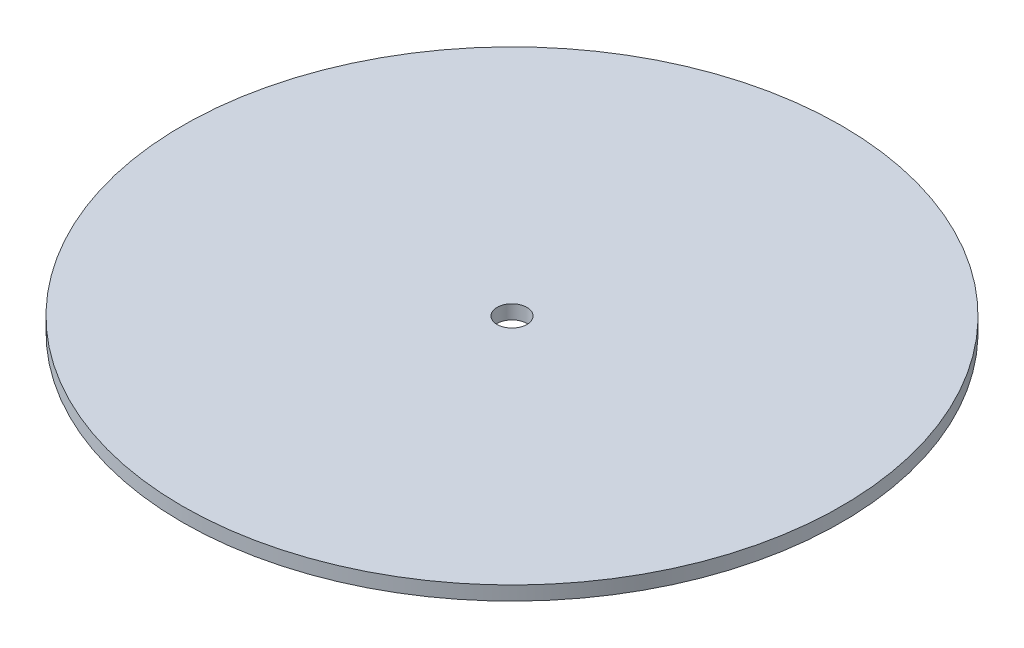
ISO-10303-21;
HEADER;
FILE_DESCRIPTION(('STEP AP214'),'2;1');
FILE_NAME('part.step','',(''),(''),'','','');
FILE_SCHEMA(('AUTOMOTIVE_DESIGN { 1 0 10303 214 1 1 1 1 }'));
ENDSEC;
DATA;
#1=APPLICATION_CONTEXT('core data for automotive mechanical design processes');
#2=APPLICATION_PROTOCOL_DEFINITION('international standard','automotive_design',2000,#1);
#3=PRODUCT_CONTEXT('',#1,'mechanical');
#4=PRODUCT('Part','Part','',(#3));
#5=PRODUCT_RELATED_PRODUCT_CATEGORY('part','',(#4));
#6=PRODUCT_DEFINITION_FORMATION('','',#4);
#7=PRODUCT_DEFINITION_CONTEXT('part definition',#1,'design');
#8=PRODUCT_DEFINITION('design','',#6,#7);
#9=PRODUCT_DEFINITION_SHAPE('','',#8);
#10=(LENGTH_UNIT() NAMED_UNIT(*) SI_UNIT(.MILLI.,.METRE.));
#11=(NAMED_UNIT(*) PLANE_ANGLE_UNIT() SI_UNIT($,.RADIAN.));
#12=(NAMED_UNIT(*) SI_UNIT($,.STERADIAN.) SOLID_ANGLE_UNIT());
#13=UNCERTAINTY_MEASURE_WITH_UNIT(LENGTH_MEASURE(1.E-05),#10,'distance_accuracy_value','');
#14=(GEOMETRIC_REPRESENTATION_CONTEXT(3) GLOBAL_UNCERTAINTY_ASSIGNED_CONTEXT((#13)) GLOBAL_UNIT_ASSIGNED_CONTEXT((#10,
#11,#12)) REPRESENTATION_CONTEXT('',''));
#15=CARTESIAN_POINT('',(0.,0.,0.));
#16=DIRECTION('',(0.,0.,1.));
#17=DIRECTION('',(1.,0.,0.));
#18=AXIS2_PLACEMENT_3D('',#15,#16,#17);
#19=CARTESIAN_POINT('',(0.,3.175,0.));
#20=DIRECTION('',(0.,-1.,0.));
#21=DIRECTION('',(0.,0.,-1.));
#22=AXIS2_PLACEMENT_3D('',#19,#20,#21);
#23=CYLINDRICAL_SURFACE('',#22,74.7776);
#24=CARTESIAN_POINT('',(0.,3.175,0.));
#25=DIRECTION('',(0.,1.,0.));
#26=DIRECTION('',(0.,0.,1.));
#27=AXIS2_PLACEMENT_3D('',#24,#25,#26);
#28=CIRCLE('',#27,74.7776);
#29=CARTESIAN_POINT('',(0.,3.175,74.7776));
#30=VERTEX_POINT('',#29);
#31=EDGE_CURVE('E10',#30,#30,#28,.T.);
#32=ORIENTED_EDGE('',*,*,#31,.F.);
#33=EDGE_LOOP('',(#32));
#34=FACE_BOUND('',#33,.T.);
#35=CARTESIAN_POINT('',(0.,0.,0.));
#36=DIRECTION('',(0.,1.,0.));
#37=DIRECTION('',(0.,0.,1.));
#38=AXIS2_PLACEMENT_3D('',#35,#36,#37);
#39=CIRCLE('',#38,74.7776);
#40=CARTESIAN_POINT('',(0.,0.,74.7776));
#41=VERTEX_POINT('',#40);
#42=EDGE_CURVE('E40',#41,#41,#39,.T.);
#43=ORIENTED_EDGE('',*,*,#42,.T.);
#44=EDGE_LOOP('',(#43));
#45=FACE_BOUND('',#44,.T.);
#46=ADVANCED_FACE('F37',(#34,#45),#23,.T.);
#47=CARTESIAN_POINT('',(0.,3.175,0.));
#48=DIRECTION('',(0.,1.,0.));
#49=DIRECTION('',(0.,0.,1.));
#50=AXIS2_PLACEMENT_3D('',#47,#48,#49);
#51=PLANE('',#50);
#52=CARTESIAN_POINT('',(0.,3.175,0.));
#53=DIRECTION('',(0.,1.,0.));
#54=DIRECTION('',(0.,0.,1.));
#55=AXIS2_PLACEMENT_3D('',#52,#53,#54);
#56=CIRCLE('',#55,3.3782);
#57=CARTESIAN_POINT('',(0.,3.175,3.3782));
#58=VERTEX_POINT('',#57);
#59=EDGE_CURVE('E54',#58,#58,#56,.T.);
#60=ORIENTED_EDGE('',*,*,#59,.F.);
#61=EDGE_LOOP('',(#60));
#62=FACE_BOUND('',#61,.T.);
#63=ORIENTED_EDGE('',*,*,#31,.T.);
#64=EDGE_LOOP('',(#63));
#65=FACE_BOUND('',#64,.T.);
#66=ADVANCED_FACE('F61',(#62,#65),#51,.T.);
#67=CARTESIAN_POINT('',(0.,0.,0.));
#68=DIRECTION('',(0.,1.,0.));
#69=DIRECTION('',(0.,0.,1.));
#70=AXIS2_PLACEMENT_3D('',#67,#68,#69);
#71=PLANE('',#70);
#72=CARTESIAN_POINT('',(0.,0.,0.));
#73=DIRECTION('',(0.,1.,0.));
#74=DIRECTION('',(0.,0.,1.));
#75=AXIS2_PLACEMENT_3D('',#72,#73,#74);
#76=CIRCLE('',#75,3.3782);
#77=CARTESIAN_POINT('',(0.,0.,3.3782));
#78=VERTEX_POINT('',#77);
#79=EDGE_CURVE('E49',#78,#78,#76,.T.);
#80=ORIENTED_EDGE('',*,*,#79,.T.);
#81=EDGE_LOOP('',(#80));
#82=FACE_BOUND('',#81,.T.);
#83=ORIENTED_EDGE('',*,*,#42,.F.);
#84=EDGE_LOOP('',(#83));
#85=FACE_BOUND('',#84,.T.);
#86=ADVANCED_FACE('F63',(#82,#85),#71,.F.);
#87=CARTESIAN_POINT('',(0.,3.175,0.));
#88=DIRECTION('',(0.,1.,0.));
#89=DIRECTION('',(0.,0.,1.));
#90=AXIS2_PLACEMENT_3D('',#87,#88,#89);
#91=CYLINDRICAL_SURFACE('',#90,3.3782);
#92=ORIENTED_EDGE('',*,*,#79,.F.);
#93=EDGE_LOOP('',(#92));
#94=FACE_BOUND('',#93,.T.);
#95=ORIENTED_EDGE('',*,*,#59,.T.);
#96=EDGE_LOOP('',(#95));
#97=FACE_BOUND('',#96,.T.);
#98=ADVANCED_FACE('F59',(#94,#97),#91,.F.);
#99=CLOSED_SHELL('',(#46,#66,#86,#98));
#100=MANIFOLD_SOLID_BREP('B2',#99);
#101=ADVANCED_BREP_SHAPE_REPRESENTATION('',(#18,#100),#14);
#102=SHAPE_DEFINITION_REPRESENTATION(#9,#101);
ENDSEC;
END-ISO-10303-21;
